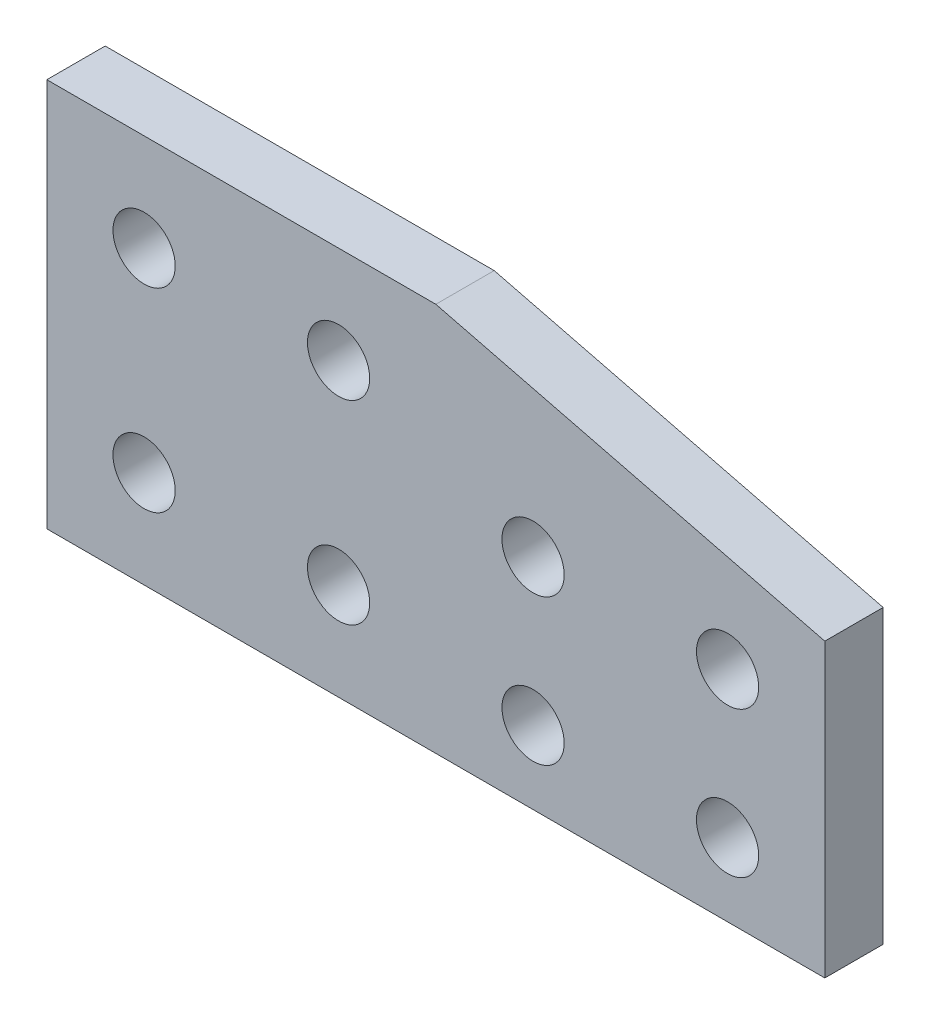
ISO-10303-21;
HEADER;
FILE_DESCRIPTION(('STEP AP214'),'2;1');
FILE_NAME('part.step','',(''),(''),'','','');
FILE_SCHEMA(('AUTOMOTIVE_DESIGN { 1 0 10303 214 1 1 1 1 }'));
ENDSEC;
DATA;
#1=APPLICATION_CONTEXT('core data for automotive mechanical design processes');
#2=APPLICATION_PROTOCOL_DEFINITION('international standard','automotive_design',2000,#1);
#3=PRODUCT_CONTEXT('',#1,'mechanical');
#4=PRODUCT('Part','Part','',(#3));
#5=PRODUCT_RELATED_PRODUCT_CATEGORY('part','',(#4));
#6=PRODUCT_DEFINITION_FORMATION('','',#4);
#7=PRODUCT_DEFINITION_CONTEXT('part definition',#1,'design');
#8=PRODUCT_DEFINITION('design','',#6,#7);
#9=PRODUCT_DEFINITION_SHAPE('','',#8);
#10=(LENGTH_UNIT() NAMED_UNIT(*) SI_UNIT(.MILLI.,.METRE.));
#11=(NAMED_UNIT(*) PLANE_ANGLE_UNIT() SI_UNIT($,.RADIAN.));
#12=(NAMED_UNIT(*) SI_UNIT($,.STERADIAN.) SOLID_ANGLE_UNIT());
#13=UNCERTAINTY_MEASURE_WITH_UNIT(LENGTH_MEASURE(1.E-05),#10,'distance_accuracy_value','');
#14=(GEOMETRIC_REPRESENTATION_CONTEXT(3) GLOBAL_UNCERTAINTY_ASSIGNED_CONTEXT((#13)) GLOBAL_UNIT_ASSIGNED_CONTEXT((#10,
#11,#12)) REPRESENTATION_CONTEXT('',''));
#15=CARTESIAN_POINT('',(0.,0.,0.));
#16=DIRECTION('',(0.,0.,1.));
#17=DIRECTION('',(1.,0.,0.));
#18=AXIS2_PLACEMENT_3D('',#15,#16,#17);
#19=CARTESIAN_POINT('',(0.,-20.,3.));
#20=DIRECTION('',(1.,0.,0.));
#21=DIRECTION('',(0.,1.,0.));
#22=AXIS2_PLACEMENT_3D('',#19,#20,#21);
#23=PLANE('',#22);
#24=DIRECTION('',(0.,-1.,0.));
#25=VECTOR('',#24,1.);
#26=CARTESIAN_POINT('',(0.,-20.,0.));
#27=LINE('',#26,#25);
#28=CARTESIAN_POINT('',(0.,0.,0.));
#29=VERTEX_POINT('',#28);
#30=CARTESIAN_POINT('',(0.,-20.,0.));
#31=VERTEX_POINT('',#30);
#32=EDGE_CURVE('E160',#29,#31,#27,.T.);
#33=ORIENTED_EDGE('',*,*,#32,.T.);
#34=DIRECTION('',(0.,0.,-1.));
#35=VECTOR('',#34,1.);
#36=CARTESIAN_POINT('',(0.,-20.,3.));
#37=LINE('',#36,#35);
#38=CARTESIAN_POINT('',(0.,-20.,3.));
#39=VERTEX_POINT('',#38);
#40=EDGE_CURVE('E11',#39,#31,#37,.T.);
#41=ORIENTED_EDGE('',*,*,#40,.F.);
#42=DIRECTION('',(0.,-1.,0.));
#43=VECTOR('',#42,1.);
#44=CARTESIAN_POINT('',(0.,-20.,3.));
#45=LINE('',#44,#43);
#46=CARTESIAN_POINT('',(0.,0.,3.));
#47=VERTEX_POINT('',#46);
#48=EDGE_CURVE('E163',#47,#39,#45,.T.);
#49=ORIENTED_EDGE('',*,*,#48,.F.);
#50=DIRECTION('',(0.,0.,-1.));
#51=VECTOR('',#50,1.);
#52=CARTESIAN_POINT('',(0.,0.,3.));
#53=LINE('',#52,#51);
#54=EDGE_CURVE('E167',#47,#29,#53,.T.);
#55=ORIENTED_EDGE('',*,*,#54,.T.);
#56=EDGE_LOOP('',(#33,#41,#49,#55));
#57=FACE_BOUND('',#56,.T.);
#58=ADVANCED_FACE('F41',(#57),#23,.F.);
#59=CARTESIAN_POINT('',(40.,-20.,3.));
#60=DIRECTION('',(0.,1.,0.));
#61=DIRECTION('',(0.,0.,1.));
#62=AXIS2_PLACEMENT_3D('',#59,#60,#61);
#63=PLANE('',#62);
#64=DIRECTION('',(1.,0.,0.));
#65=VECTOR('',#64,1.);
#66=CARTESIAN_POINT('',(40.,-20.,0.));
#67=LINE('',#66,#65);
#68=CARTESIAN_POINT('',(40.,-20.,0.));
#69=VERTEX_POINT('',#68);
#70=EDGE_CURVE('E170',#31,#69,#67,.T.);
#71=ORIENTED_EDGE('',*,*,#70,.T.);
#72=DIRECTION('',(0.,0.,-1.));
#73=VECTOR('',#72,1.);
#74=CARTESIAN_POINT('',(40.,-20.,3.));
#75=LINE('',#74,#73);
#76=CARTESIAN_POINT('',(40.,-20.,3.));
#77=VERTEX_POINT('',#76);
#78=EDGE_CURVE('E49',#77,#69,#75,.T.);
#79=ORIENTED_EDGE('',*,*,#78,.F.);
#80=DIRECTION('',(1.,0.,0.));
#81=VECTOR('',#80,1.);
#82=CARTESIAN_POINT('',(40.,-20.,3.));
#83=LINE('',#82,#81);
#84=EDGE_CURVE('E87',#39,#77,#83,.T.);
#85=ORIENTED_EDGE('',*,*,#84,.F.);
#86=ORIENTED_EDGE('',*,*,#40,.T.);
#87=EDGE_LOOP('',(#71,#79,#85,#86));
#88=FACE_BOUND('',#87,.T.);
#89=ADVANCED_FACE('F190',(#88),#63,.F.);
#90=CARTESIAN_POINT('',(40.,-5.,3.));
#91=DIRECTION('',(-1.,0.,0.));
#92=DIRECTION('',(0.,-1.,0.));
#93=AXIS2_PLACEMENT_3D('',#90,#91,#92);
#94=PLANE('',#93);
#95=DIRECTION('',(0.,1.,0.));
#96=VECTOR('',#95,1.);
#97=CARTESIAN_POINT('',(40.,-5.,0.));
#98=LINE('',#97,#96);
#99=CARTESIAN_POINT('',(40.,-5.,0.));
#100=VERTEX_POINT('',#99);
#101=EDGE_CURVE('E104',#69,#100,#98,.T.);
#102=ORIENTED_EDGE('',*,*,#101,.T.);
#103=DIRECTION('',(0.,0.,-1.));
#104=VECTOR('',#103,1.);
#105=CARTESIAN_POINT('',(40.,-5.,3.));
#106=LINE('',#105,#104);
#107=CARTESIAN_POINT('',(40.,-5.,3.));
#108=VERTEX_POINT('',#107);
#109=EDGE_CURVE('E101',#108,#100,#106,.T.);
#110=ORIENTED_EDGE('',*,*,#109,.F.);
#111=DIRECTION('',(0.,1.,0.));
#112=VECTOR('',#111,1.);
#113=CARTESIAN_POINT('',(40.,-5.,3.));
#114=LINE('',#113,#112);
#115=EDGE_CURVE('E91',#77,#108,#114,.T.);
#116=ORIENTED_EDGE('',*,*,#115,.F.);
#117=ORIENTED_EDGE('',*,*,#78,.T.);
#118=EDGE_LOOP('',(#102,#110,#116,#117));
#119=FACE_BOUND('',#118,.T.);
#120=ADVANCED_FACE('F102',(#119),#94,.F.);
#121=CARTESIAN_POINT('',(0.,0.,3.));
#122=DIRECTION('',(0.,-1.,0.));
#123=DIRECTION('',(0.,0.,-1.));
#124=AXIS2_PLACEMENT_3D('',#121,#122,#123);
#125=PLANE('',#124);
#126=DIRECTION('',(-1.,0.,0.));
#127=VECTOR('',#126,1.);
#128=CARTESIAN_POINT('',(0.,0.,0.));
#129=LINE('',#128,#127);
#130=CARTESIAN_POINT('',(20.,0.,0.));
#131=VERTEX_POINT('',#130);
#132=EDGE_CURVE('E79',#131,#29,#129,.T.);
#133=ORIENTED_EDGE('',*,*,#132,.T.);
#134=ORIENTED_EDGE('',*,*,#54,.F.);
#135=DIRECTION('',(-1.,0.,0.));
#136=VECTOR('',#135,1.);
#137=CARTESIAN_POINT('',(0.,0.,3.));
#138=LINE('',#137,#136);
#139=CARTESIAN_POINT('',(20.,0.,3.));
#140=VERTEX_POINT('',#139);
#141=EDGE_CURVE('E57',#140,#47,#138,.T.);
#142=ORIENTED_EDGE('',*,*,#141,.F.);
#143=DIRECTION('',(0.,0.,-1.));
#144=VECTOR('',#143,1.);
#145=CARTESIAN_POINT('',(20.,0.,3.));
#146=LINE('',#145,#144);
#147=EDGE_CURVE('E76',#140,#131,#146,.T.);
#148=ORIENTED_EDGE('',*,*,#147,.T.);
#149=EDGE_LOOP('',(#133,#134,#142,#148));
#150=FACE_BOUND('',#149,.T.);
#151=ADVANCED_FACE('F182',(#150),#125,.F.);
#152=CARTESIAN_POINT('',(0.,0.,3.));
#153=DIRECTION('',(0.,0.,-1.));
#154=DIRECTION('',(-1.,0.,0.));
#155=AXIS2_PLACEMENT_3D('',#152,#153,#154);
#156=PLANE('',#155);
#157=DIRECTION('',(-0.970142500145332,0.242535625036333,0.));
#158=VECTOR('',#157,1.);
#159=CARTESIAN_POINT('',(20.,0.,3.));
#160=LINE('',#159,#158);
#161=EDGE_CURVE('E96',#108,#140,#160,.T.);
#162=ORIENTED_EDGE('',*,*,#161,.T.);
#163=ORIENTED_EDGE('',*,*,#141,.T.);
#164=ORIENTED_EDGE('',*,*,#48,.T.);
#165=ORIENTED_EDGE('',*,*,#84,.T.);
#166=ORIENTED_EDGE('',*,*,#115,.T.);
#167=EDGE_LOOP('',(#162,#163,#164,#165,#166));
#168=FACE_BOUND('',#167,.T.);
#169=CARTESIAN_POINT('',(15.,-15.,3.));
#170=DIRECTION('',(0.,0.,1.));
#171=DIRECTION('',(1.,0.,0.));
#172=AXIS2_PLACEMENT_3D('',#169,#170,#171);
#173=CIRCLE('',#172,1.6);
#174=CARTESIAN_POINT('',(16.6,-15.,3.));
#175=VERTEX_POINT('',#174);
#176=EDGE_CURVE('E140',#175,#175,#173,.T.);
#177=ORIENTED_EDGE('',*,*,#176,.F.);
#178=EDGE_LOOP('',(#177));
#179=FACE_BOUND('',#178,.T.);
#180=CARTESIAN_POINT('',(15.,-5.,3.));
#181=DIRECTION('',(0.,0.,1.));
#182=DIRECTION('',(-1.,0.,0.));
#183=AXIS2_PLACEMENT_3D('',#180,#181,#182);
#184=CIRCLE('',#183,1.6);
#185=CARTESIAN_POINT('',(13.4,-5.,3.));
#186=VERTEX_POINT('',#185);
#187=EDGE_CURVE('E133',#186,#186,#184,.T.);
#188=ORIENTED_EDGE('',*,*,#187,.F.);
#189=EDGE_LOOP('',(#188));
#190=FACE_BOUND('',#189,.T.);
#191=CARTESIAN_POINT('',(5.,-15.,3.));
#192=DIRECTION('',(0.,0.,1.));
#193=DIRECTION('',(-1.,0.,0.));
#194=AXIS2_PLACEMENT_3D('',#191,#192,#193);
#195=CIRCLE('',#194,1.6);
#196=CARTESIAN_POINT('',(3.4,-15.,3.));
#197=VERTEX_POINT('',#196);
#198=EDGE_CURVE('E152',#197,#197,#195,.T.);
#199=ORIENTED_EDGE('',*,*,#198,.F.);
#200=EDGE_LOOP('',(#199));
#201=FACE_BOUND('',#200,.T.);
#202=CARTESIAN_POINT('',(35.,-8.75,3.));
#203=DIRECTION('',(0.,0.,1.));
#204=DIRECTION('',(1.,0.,0.));
#205=AXIS2_PLACEMENT_3D('',#202,#203,#204);
#206=CIRCLE('',#205,1.6);
#207=CARTESIAN_POINT('',(36.6,-8.75,3.));
#208=VERTEX_POINT('',#207);
#209=EDGE_CURVE('E145',#208,#208,#206,.T.);
#210=ORIENTED_EDGE('',*,*,#209,.F.);
#211=EDGE_LOOP('',(#210));
#212=FACE_BOUND('',#211,.T.);
#213=CARTESIAN_POINT('',(35.,-16.25,3.));
#214=DIRECTION('',(0.,0.,1.));
#215=DIRECTION('',(-1.,0.,0.));
#216=AXIS2_PLACEMENT_3D('',#213,#214,#215);
#217=CIRCLE('',#216,1.6);
#218=CARTESIAN_POINT('',(33.4,-16.25,3.));
#219=VERTEX_POINT('',#218);
#220=EDGE_CURVE('E115',#219,#219,#217,.T.);
#221=ORIENTED_EDGE('',*,*,#220,.F.);
#222=EDGE_LOOP('',(#221));
#223=FACE_BOUND('',#222,.T.);
#224=CARTESIAN_POINT('',(25.,-16.25,3.));
#225=DIRECTION('',(0.,0.,1.));
#226=DIRECTION('',(1.,0.,0.));
#227=AXIS2_PLACEMENT_3D('',#224,#225,#226);
#228=CIRCLE('',#227,1.6);
#229=CARTESIAN_POINT('',(26.6,-16.25,3.));
#230=VERTEX_POINT('',#229);
#231=EDGE_CURVE('E122',#230,#230,#228,.T.);
#232=ORIENTED_EDGE('',*,*,#231,.F.);
#233=EDGE_LOOP('',(#232));
#234=FACE_BOUND('',#233,.T.);
#235=CARTESIAN_POINT('',(25.,-8.75,3.));
#236=DIRECTION('',(0.,0.,1.));
#237=DIRECTION('',(-1.,0.,0.));
#238=AXIS2_PLACEMENT_3D('',#235,#236,#237);
#239=CIRCLE('',#238,1.6);
#240=CARTESIAN_POINT('',(23.4,-8.75,3.));
#241=VERTEX_POINT('',#240);
#242=EDGE_CURVE('E128',#241,#241,#239,.T.);
#243=ORIENTED_EDGE('',*,*,#242,.F.);
#244=EDGE_LOOP('',(#243));
#245=FACE_BOUND('',#244,.T.);
#246=CARTESIAN_POINT('',(5.,-5.,3.));
#247=DIRECTION('',(0.,0.,1.));
#248=DIRECTION('',(1.,0.,0.));
#249=AXIS2_PLACEMENT_3D('',#246,#247,#248);
#250=CIRCLE('',#249,1.6);
#251=CARTESIAN_POINT('',(6.6,-5.,3.));
#252=VERTEX_POINT('',#251);
#253=EDGE_CURVE('E148',#252,#252,#250,.T.);
#254=ORIENTED_EDGE('',*,*,#253,.F.);
#255=EDGE_LOOP('',(#254));
#256=FACE_BOUND('',#255,.T.);
#257=ADVANCED_FACE('F93',(#168,#179,#190,#201,#212,#223,#234,#245,#256),#156,.F.);
#258=CARTESIAN_POINT('',(0.,0.,0.));
#259=DIRECTION('',(0.,0.,-1.));
#260=DIRECTION('',(-1.,0.,0.));
#261=AXIS2_PLACEMENT_3D('',#258,#259,#260);
#262=PLANE('',#261);
#263=ORIENTED_EDGE('',*,*,#132,.F.);
#264=DIRECTION('',(-0.970142500145332,0.242535625036333,0.));
#265=VECTOR('',#264,1.);
#266=CARTESIAN_POINT('',(20.,0.,0.));
#267=LINE('',#266,#265);
#268=EDGE_CURVE('E110',#100,#131,#267,.T.);
#269=ORIENTED_EDGE('',*,*,#268,.F.);
#270=ORIENTED_EDGE('',*,*,#101,.F.);
#271=ORIENTED_EDGE('',*,*,#70,.F.);
#272=ORIENTED_EDGE('',*,*,#32,.F.);
#273=EDGE_LOOP('',(#263,#269,#270,#271,#272));
#274=FACE_BOUND('',#273,.T.);
#275=CARTESIAN_POINT('',(15.,-15.,0.));
#276=DIRECTION('',(0.,0.,1.));
#277=DIRECTION('',(1.,0.,0.));
#278=AXIS2_PLACEMENT_3D('',#275,#276,#277);
#279=CIRCLE('',#278,1.6);
#280=CARTESIAN_POINT('',(16.6,-15.,0.));
#281=VERTEX_POINT('',#280);
#282=EDGE_CURVE('E118',#281,#281,#279,.T.);
#283=ORIENTED_EDGE('',*,*,#282,.T.);
#284=EDGE_LOOP('',(#283));
#285=FACE_BOUND('',#284,.T.);
#286=CARTESIAN_POINT('',(15.,-5.,0.));
#287=DIRECTION('',(0.,0.,1.));
#288=DIRECTION('',(-1.,0.,0.));
#289=AXIS2_PLACEMENT_3D('',#286,#287,#288);
#290=CIRCLE('',#289,1.6);
#291=CARTESIAN_POINT('',(13.4,-5.,0.));
#292=VERTEX_POINT('',#291);
#293=EDGE_CURVE('E137',#292,#292,#290,.T.);
#294=ORIENTED_EDGE('',*,*,#293,.T.);
#295=EDGE_LOOP('',(#294));
#296=FACE_BOUND('',#295,.T.);
#297=CARTESIAN_POINT('',(5.,-15.,0.));
#298=DIRECTION('',(0.,0.,1.));
#299=DIRECTION('',(-1.,0.,0.));
#300=AXIS2_PLACEMENT_3D('',#297,#298,#299);
#301=CIRCLE('',#300,1.6);
#302=CARTESIAN_POINT('',(3.4,-15.,0.));
#303=VERTEX_POINT('',#302);
#304=EDGE_CURVE('E136',#303,#303,#301,.T.);
#305=ORIENTED_EDGE('',*,*,#304,.T.);
#306=EDGE_LOOP('',(#305));
#307=FACE_BOUND('',#306,.T.);
#308=CARTESIAN_POINT('',(35.,-8.75,0.));
#309=DIRECTION('',(0.,0.,1.));
#310=DIRECTION('',(1.,0.,0.));
#311=AXIS2_PLACEMENT_3D('',#308,#309,#310);
#312=CIRCLE('',#311,1.6);
#313=CARTESIAN_POINT('',(36.6,-8.75,0.));
#314=VERTEX_POINT('',#313);
#315=EDGE_CURVE('E149',#314,#314,#312,.T.);
#316=ORIENTED_EDGE('',*,*,#315,.T.);
#317=EDGE_LOOP('',(#316));
#318=FACE_BOUND('',#317,.T.);
#319=CARTESIAN_POINT('',(35.,-16.25,0.));
#320=DIRECTION('',(0.,0.,1.));
#321=DIRECTION('',(-1.,0.,0.));
#322=AXIS2_PLACEMENT_3D('',#319,#320,#321);
#323=CIRCLE('',#322,1.6);
#324=CARTESIAN_POINT('',(33.4,-16.25,0.));
#325=VERTEX_POINT('',#324);
#326=EDGE_CURVE('E119',#325,#325,#323,.T.);
#327=ORIENTED_EDGE('',*,*,#326,.T.);
#328=EDGE_LOOP('',(#327));
#329=FACE_BOUND('',#328,.T.);
#330=CARTESIAN_POINT('',(25.,-16.25,0.));
#331=DIRECTION('',(0.,0.,1.));
#332=DIRECTION('',(1.,0.,0.));
#333=AXIS2_PLACEMENT_3D('',#330,#331,#332);
#334=CIRCLE('',#333,1.6);
#335=CARTESIAN_POINT('',(26.6,-16.25,0.));
#336=VERTEX_POINT('',#335);
#337=EDGE_CURVE('E125',#336,#336,#334,.T.);
#338=ORIENTED_EDGE('',*,*,#337,.T.);
#339=EDGE_LOOP('',(#338));
#340=FACE_BOUND('',#339,.T.);
#341=CARTESIAN_POINT('',(25.,-8.75,0.));
#342=DIRECTION('',(0.,0.,1.));
#343=DIRECTION('',(-1.,0.,0.));
#344=AXIS2_PLACEMENT_3D('',#341,#342,#343);
#345=CIRCLE('',#344,1.6);
#346=CARTESIAN_POINT('',(23.4,-8.75,0.));
#347=VERTEX_POINT('',#346);
#348=EDGE_CURVE('E112',#347,#347,#345,.T.);
#349=ORIENTED_EDGE('',*,*,#348,.T.);
#350=EDGE_LOOP('',(#349));
#351=FACE_BOUND('',#350,.T.);
#352=CARTESIAN_POINT('',(5.,-5.,0.));
#353=DIRECTION('',(0.,0.,1.));
#354=DIRECTION('',(1.,0.,0.));
#355=AXIS2_PLACEMENT_3D('',#352,#353,#354);
#356=CIRCLE('',#355,1.6);
#357=CARTESIAN_POINT('',(6.6,-5.,0.));
#358=VERTEX_POINT('',#357);
#359=EDGE_CURVE('E157',#358,#358,#356,.T.);
#360=ORIENTED_EDGE('',*,*,#359,.T.);
#361=EDGE_LOOP('',(#360));
#362=FACE_BOUND('',#361,.T.);
#363=ADVANCED_FACE('F176',(#274,#285,#296,#307,#318,#329,#340,#351,#362),#262,.T.);
#364=CARTESIAN_POINT('',(5.,-5.,0.));
#365=DIRECTION('',(0.,0.,1.));
#366=DIRECTION('',(1.,0.,0.));
#367=AXIS2_PLACEMENT_3D('',#364,#365,#366);
#368=CYLINDRICAL_SURFACE('',#367,1.6);
#369=ORIENTED_EDGE('',*,*,#359,.F.);
#370=EDGE_LOOP('',(#369));
#371=FACE_BOUND('',#370,.T.);
#372=ORIENTED_EDGE('',*,*,#253,.T.);
#373=EDGE_LOOP('',(#372));
#374=FACE_BOUND('',#373,.T.);
#375=ADVANCED_FACE('F204',(#371,#374),#368,.F.);
#376=CARTESIAN_POINT('',(25.,-8.75,0.));
#377=DIRECTION('',(0.,0.,1.));
#378=DIRECTION('',(1.,0.,0.));
#379=AXIS2_PLACEMENT_3D('',#376,#377,#378);
#380=CYLINDRICAL_SURFACE('',#379,1.6);
#381=ORIENTED_EDGE('',*,*,#348,.F.);
#382=EDGE_LOOP('',(#381));
#383=FACE_BOUND('',#382,.T.);
#384=ORIENTED_EDGE('',*,*,#242,.T.);
#385=EDGE_LOOP('',(#384));
#386=FACE_BOUND('',#385,.T.);
#387=ADVANCED_FACE('F208',(#383,#386),#380,.F.);
#388=CARTESIAN_POINT('',(25.,-16.25,0.));
#389=DIRECTION('',(0.,0.,1.));
#390=DIRECTION('',(1.,0.,0.));
#391=AXIS2_PLACEMENT_3D('',#388,#389,#390);
#392=CYLINDRICAL_SURFACE('',#391,1.6);
#393=ORIENTED_EDGE('',*,*,#337,.F.);
#394=EDGE_LOOP('',(#393));
#395=FACE_BOUND('',#394,.T.);
#396=ORIENTED_EDGE('',*,*,#231,.T.);
#397=EDGE_LOOP('',(#396));
#398=FACE_BOUND('',#397,.T.);
#399=ADVANCED_FACE('F218',(#395,#398),#392,.F.);
#400=CARTESIAN_POINT('',(35.,-16.25,0.));
#401=DIRECTION('',(0.,0.,1.));
#402=DIRECTION('',(1.,0.,0.));
#403=AXIS2_PLACEMENT_3D('',#400,#401,#402);
#404=CYLINDRICAL_SURFACE('',#403,1.6);
#405=ORIENTED_EDGE('',*,*,#326,.F.);
#406=EDGE_LOOP('',(#405));
#407=FACE_BOUND('',#406,.T.);
#408=ORIENTED_EDGE('',*,*,#220,.T.);
#409=EDGE_LOOP('',(#408));
#410=FACE_BOUND('',#409,.T.);
#411=ADVANCED_FACE('F227',(#407,#410),#404,.F.);
#412=CARTESIAN_POINT('',(35.,-8.75,0.));
#413=DIRECTION('',(0.,0.,1.));
#414=DIRECTION('',(1.,0.,0.));
#415=AXIS2_PLACEMENT_3D('',#412,#413,#414);
#416=CYLINDRICAL_SURFACE('',#415,1.6);
#417=ORIENTED_EDGE('',*,*,#315,.F.);
#418=EDGE_LOOP('',(#417));
#419=FACE_BOUND('',#418,.T.);
#420=ORIENTED_EDGE('',*,*,#209,.T.);
#421=EDGE_LOOP('',(#420));
#422=FACE_BOUND('',#421,.T.);
#423=ADVANCED_FACE('F236',(#419,#422),#416,.F.);
#424=CARTESIAN_POINT('',(5.,-15.,0.));
#425=DIRECTION('',(0.,0.,1.));
#426=DIRECTION('',(1.,0.,0.));
#427=AXIS2_PLACEMENT_3D('',#424,#425,#426);
#428=CYLINDRICAL_SURFACE('',#427,1.6);
#429=ORIENTED_EDGE('',*,*,#304,.F.);
#430=EDGE_LOOP('',(#429));
#431=FACE_BOUND('',#430,.T.);
#432=ORIENTED_EDGE('',*,*,#198,.T.);
#433=EDGE_LOOP('',(#432));
#434=FACE_BOUND('',#433,.T.);
#435=ADVANCED_FACE('F245',(#431,#434),#428,.F.);
#436=CARTESIAN_POINT('',(15.,-5.,0.));
#437=DIRECTION('',(0.,0.,1.));
#438=DIRECTION('',(1.,0.,0.));
#439=AXIS2_PLACEMENT_3D('',#436,#437,#438);
#440=CYLINDRICAL_SURFACE('',#439,1.6);
#441=ORIENTED_EDGE('',*,*,#293,.F.);
#442=EDGE_LOOP('',(#441));
#443=FACE_BOUND('',#442,.T.);
#444=ORIENTED_EDGE('',*,*,#187,.T.);
#445=EDGE_LOOP('',(#444));
#446=FACE_BOUND('',#445,.T.);
#447=ADVANCED_FACE('F254',(#443,#446),#440,.F.);
#448=CARTESIAN_POINT('',(15.,-15.,0.));
#449=DIRECTION('',(0.,0.,1.));
#450=DIRECTION('',(1.,0.,0.));
#451=AXIS2_PLACEMENT_3D('',#448,#449,#450);
#452=CYLINDRICAL_SURFACE('',#451,1.6);
#453=ORIENTED_EDGE('',*,*,#282,.F.);
#454=EDGE_LOOP('',(#453));
#455=FACE_BOUND('',#454,.T.);
#456=ORIENTED_EDGE('',*,*,#176,.T.);
#457=EDGE_LOOP('',(#456));
#458=FACE_BOUND('',#457,.T.);
#459=ADVANCED_FACE('F263',(#455,#458),#452,.F.);
#460=CARTESIAN_POINT('',(20.,0.,0.));
#461=DIRECTION('',(0.242535625036333,0.970142500145332,0.));
#462=DIRECTION('',(-0.970142500145332,0.242535625036333,0.));
#463=AXIS2_PLACEMENT_3D('',#460,#461,#462);
#464=PLANE('',#463);
#465=ORIENTED_EDGE('',*,*,#161,.F.);
#466=ORIENTED_EDGE('',*,*,#109,.T.);
#467=ORIENTED_EDGE('',*,*,#268,.T.);
#468=ORIENTED_EDGE('',*,*,#147,.F.);
#469=EDGE_LOOP('',(#465,#466,#467,#468));
#470=FACE_BOUND('',#469,.T.);
#471=ADVANCED_FACE('F109',(#470),#464,.T.);
#472=CLOSED_SHELL('',(#58,#89,#120,#151,#257,#363,#375,#387,#399,#411,#423,#435,#447,#459,#471));
#473=MANIFOLD_SOLID_BREP('B2',#472);
#474=ADVANCED_BREP_SHAPE_REPRESENTATION('',(#18,#473),#14);
#475=SHAPE_DEFINITION_REPRESENTATION(#9,#474);
ENDSEC;
END-ISO-10303-21;
